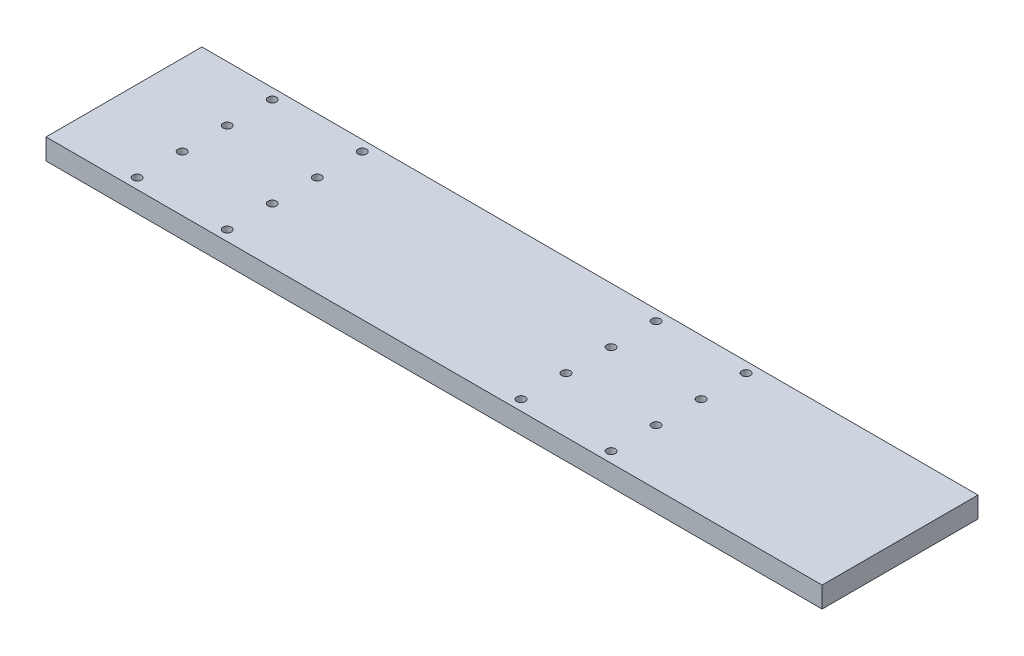
ISO-10303-21;
HEADER;
FILE_DESCRIPTION(('STEP AP214'),'2;1');
FILE_NAME('part.step','',(''),(''),'','','');
FILE_SCHEMA(('AUTOMOTIVE_DESIGN { 1 0 10303 214 1 1 1 1 }'));
ENDSEC;
DATA;
#1=APPLICATION_CONTEXT('core data for automotive mechanical design processes');
#2=APPLICATION_PROTOCOL_DEFINITION('international standard','automotive_design',2000,#1);
#3=PRODUCT_CONTEXT('',#1,'mechanical');
#4=PRODUCT('Part','Part','',(#3));
#5=PRODUCT_RELATED_PRODUCT_CATEGORY('part','',(#4));
#6=PRODUCT_DEFINITION_FORMATION('','',#4);
#7=PRODUCT_DEFINITION_CONTEXT('part definition',#1,'design');
#8=PRODUCT_DEFINITION('design','',#6,#7);
#9=PRODUCT_DEFINITION_SHAPE('','',#8);
#10=(LENGTH_UNIT() NAMED_UNIT(*) SI_UNIT(.MILLI.,.METRE.));
#11=(NAMED_UNIT(*) PLANE_ANGLE_UNIT() SI_UNIT($,.RADIAN.));
#12=(NAMED_UNIT(*) SI_UNIT($,.STERADIAN.) SOLID_ANGLE_UNIT());
#13=UNCERTAINTY_MEASURE_WITH_UNIT(LENGTH_MEASURE(1.E-05),#10,'distance_accuracy_value','');
#14=(GEOMETRIC_REPRESENTATION_CONTEXT(3) GLOBAL_UNCERTAINTY_ASSIGNED_CONTEXT((#13)) GLOBAL_UNIT_ASSIGNED_CONTEXT((#10,
#11,#12)) REPRESENTATION_CONTEXT('',''));
#15=CARTESIAN_POINT('',(0.,0.,0.));
#16=DIRECTION('',(0.,0.,1.));
#17=DIRECTION('',(1.,0.,0.));
#18=AXIS2_PLACEMENT_3D('',#15,#16,#17);
#19=CARTESIAN_POINT('',(0.,7.4,0.));
#20=DIRECTION('',(0.,1.,0.));
#21=DIRECTION('',(0.,0.,1.));
#22=AXIS2_PLACEMENT_3D('',#19,#20,#21);
#23=PLANE('',#22);
#24=CARTESIAN_POINT('',(35.6999998895789,7.4,-16.));
#25=DIRECTION('',(0.,1.,0.));
#26=DIRECTION('',(0.,0.,1.));
#27=AXIS2_PLACEMENT_3D('',#24,#25,#26);
#28=CIRCLE('',#27,1.50000000000003);
#29=CARTESIAN_POINT('',(35.6999998895789,7.4,-14.5));
#30=VERTEX_POINT('',#29);
#31=EDGE_CURVE('E190',#30,#30,#28,.T.);
#32=ORIENTED_EDGE('',*,*,#31,.F.);
#33=EDGE_LOOP('',(#32));
#34=FACE_BOUND('',#33,.T.);
#35=CARTESIAN_POINT('',(3.69999994478943,7.4,-32.));
#36=DIRECTION('',(0.,1.,0.));
#37=DIRECTION('',(0.,0.,1.));
#38=AXIS2_PLACEMENT_3D('',#35,#36,#37);
#39=CIRCLE('',#38,1.50000000000003);
#40=CARTESIAN_POINT('',(3.69999994478943,7.4,-30.5));
#41=VERTEX_POINT('',#40);
#42=EDGE_CURVE('E178',#41,#41,#39,.T.);
#43=ORIENTED_EDGE('',*,*,#42,.F.);
#44=EDGE_LOOP('',(#43));
#45=FACE_BOUND('',#44,.T.);
#46=CARTESIAN_POINT('',(140.1,7.4,0.));
#47=DIRECTION('',(0.,1.,0.));
#48=DIRECTION('',(0.,0.,1.));
#49=AXIS2_PLACEMENT_3D('',#46,#47,#48);
#50=CIRCLE('',#49,1.50000000000003);
#51=CARTESIAN_POINT('',(140.1,7.4,1.50000000000001));
#52=VERTEX_POINT('',#51);
#53=EDGE_CURVE('E166',#52,#52,#50,.T.);
#54=ORIENTED_EDGE('',*,*,#53,.F.);
#55=EDGE_LOOP('',(#54));
#56=FACE_BOUND('',#55,.T.);
#57=CARTESIAN_POINT('',(172.1,7.4,-48.));
#58=DIRECTION('',(0.,1.,0.));
#59=DIRECTION('',(0.,0.,1.));
#60=AXIS2_PLACEMENT_3D('',#57,#58,#59);
#61=CIRCLE('',#60,1.50000000000003);
#62=CARTESIAN_POINT('',(172.1,7.4,-46.5));
#63=VERTEX_POINT('',#62);
#64=EDGE_CURVE('E154',#63,#63,#61,.T.);
#65=ORIENTED_EDGE('',*,*,#64,.F.);
#66=EDGE_LOOP('',(#65));
#67=FACE_BOUND('',#66,.T.);
#68=CARTESIAN_POINT('',(172.1,7.4,-32.));
#69=DIRECTION('',(0.,1.,0.));
#70=DIRECTION('',(0.,0.,1.));
#71=AXIS2_PLACEMENT_3D('',#68,#69,#70);
#72=CIRCLE('',#71,1.50000000000003);
#73=CARTESIAN_POINT('',(172.1,7.4,-30.5));
#74=VERTEX_POINT('',#73);
#75=EDGE_CURVE('E142',#74,#74,#72,.T.);
#76=ORIENTED_EDGE('',*,*,#75,.F.);
#77=EDGE_LOOP('',(#76));
#78=FACE_BOUND('',#77,.T.);
#79=CARTESIAN_POINT('',(140.1,7.4,-48.));
#80=DIRECTION('',(0.,1.,0.));
#81=DIRECTION('',(0.,0.,1.));
#82=AXIS2_PLACEMENT_3D('',#79,#80,#81);
#83=CIRCLE('',#82,1.50000000000003);
#84=CARTESIAN_POINT('',(140.1,7.4,-46.5));
#85=VERTEX_POINT('',#84);
#86=EDGE_CURVE('E130',#85,#85,#83,.T.);
#87=ORIENTED_EDGE('',*,*,#86,.F.);
#88=EDGE_LOOP('',(#87));
#89=FACE_BOUND('',#88,.T.);
#90=CARTESIAN_POINT('',(35.7,7.4,0.));
#91=DIRECTION('',(0.,1.,0.));
#92=DIRECTION('',(0.,0.,1.));
#93=AXIS2_PLACEMENT_3D('',#90,#91,#92);
#94=CIRCLE('',#93,1.50000000000003);
#95=CARTESIAN_POINT('',(35.7,7.4,1.50000000000003));
#96=VERTEX_POINT('',#95);
#97=EDGE_CURVE('E118',#96,#96,#94,.T.);
#98=ORIENTED_EDGE('',*,*,#97,.F.);
#99=EDGE_LOOP('',(#98));
#100=FACE_BOUND('',#99,.T.);
#101=CARTESIAN_POINT('',(3.69999988957886,7.4,-16.));
#102=DIRECTION('',(0.,1.,0.));
#103=DIRECTION('',(0.,0.,1.));
#104=AXIS2_PLACEMENT_3D('',#101,#102,#103);
#105=CIRCLE('',#104,1.50000000000003);
#106=CARTESIAN_POINT('',(3.69999988957886,7.4,-14.5));
#107=VERTEX_POINT('',#106);
#108=EDGE_CURVE('E100',#107,#107,#105,.T.);
#109=ORIENTED_EDGE('',*,*,#108,.F.);
#110=EDGE_LOOP('',(#109));
#111=FACE_BOUND('',#110,.T.);
#112=DIRECTION('',(0.,0.,-1.));
#113=VECTOR('',#112,1.);
#114=CARTESIAN_POINT('',(250.8,7.4,3.69999999999997));
#115=LINE('',#114,#113);
#116=CARTESIAN_POINT('',(250.8,7.4,3.69999999999997));
#117=VERTEX_POINT('',#116);
#118=CARTESIAN_POINT('',(250.8,7.4,-51.7));
#119=VERTEX_POINT('',#118);
#120=EDGE_CURVE('E83',#117,#119,#115,.T.);
#121=ORIENTED_EDGE('',*,*,#120,.T.);
#122=DIRECTION('',(-1.,0.,0.));
#123=VECTOR('',#122,1.);
#124=CARTESIAN_POINT('',(250.8,7.4,-51.7));
#125=LINE('',#124,#123);
#126=CARTESIAN_POINT('',(-25.,7.4,-51.7));
#127=VERTEX_POINT('',#126);
#128=EDGE_CURVE('E77',#119,#127,#125,.T.);
#129=ORIENTED_EDGE('',*,*,#128,.T.);
#130=DIRECTION('',(0.,0.,1.));
#131=VECTOR('',#130,1.);
#132=CARTESIAN_POINT('',(-25.,7.4,-51.7));
#133=LINE('',#132,#131);
#134=CARTESIAN_POINT('',(-25.,7.4,3.7));
#135=VERTEX_POINT('',#134);
#136=EDGE_CURVE('E80',#127,#135,#133,.T.);
#137=ORIENTED_EDGE('',*,*,#136,.T.);
#138=DIRECTION('',(1.,0.,0.));
#139=VECTOR('',#138,1.);
#140=CARTESIAN_POINT('',(-25.,7.4,3.7));
#141=LINE('',#140,#139);
#142=EDGE_CURVE('E49',#135,#117,#141,.T.);
#143=ORIENTED_EDGE('',*,*,#142,.T.);
#144=EDGE_LOOP('',(#121,#129,#137,#143));
#145=FACE_BOUND('',#144,.T.);
#146=CARTESIAN_POINT('',(3.7,7.4,-48.));
#147=DIRECTION('',(0.,1.,0.));
#148=DIRECTION('',(0.,0.,1.));
#149=AXIS2_PLACEMENT_3D('',#146,#147,#148);
#150=CIRCLE('',#149,1.50000000000003);
#151=CARTESIAN_POINT('',(3.7,7.4,-46.5));
#152=VERTEX_POINT('',#151);
#153=EDGE_CURVE('E112',#152,#152,#150,.T.);
#154=ORIENTED_EDGE('',*,*,#153,.F.);
#155=EDGE_LOOP('',(#154));
#156=FACE_BOUND('',#155,.T.);
#157=CARTESIAN_POINT('',(140.1,7.4,-16.));
#158=DIRECTION('',(0.,1.,0.));
#159=DIRECTION('',(0.,0.,1.));
#160=AXIS2_PLACEMENT_3D('',#157,#158,#159);
#161=CIRCLE('',#160,1.50000000000003);
#162=CARTESIAN_POINT('',(140.1,7.4,-14.5));
#163=VERTEX_POINT('',#162);
#164=EDGE_CURVE('E124',#163,#163,#161,.T.);
#165=ORIENTED_EDGE('',*,*,#164,.F.);
#166=EDGE_LOOP('',(#165));
#167=FACE_BOUND('',#166,.T.);
#168=CARTESIAN_POINT('',(172.1,7.4,0.));
#169=DIRECTION('',(0.,1.,0.));
#170=DIRECTION('',(0.,0.,1.));
#171=AXIS2_PLACEMENT_3D('',#168,#169,#170);
#172=CIRCLE('',#171,1.50000000000003);
#173=CARTESIAN_POINT('',(172.1,7.4,1.50000000000001));
#174=VERTEX_POINT('',#173);
#175=EDGE_CURVE('E136',#174,#174,#172,.T.);
#176=ORIENTED_EDGE('',*,*,#175,.F.);
#177=EDGE_LOOP('',(#176));
#178=FACE_BOUND('',#177,.T.);
#179=CARTESIAN_POINT('',(140.1,7.4,-32.));
#180=DIRECTION('',(0.,1.,0.));
#181=DIRECTION('',(0.,0.,1.));
#182=AXIS2_PLACEMENT_3D('',#179,#180,#181);
#183=CIRCLE('',#182,1.50000000000003);
#184=CARTESIAN_POINT('',(140.1,7.4,-30.5));
#185=VERTEX_POINT('',#184);
#186=EDGE_CURVE('E148',#185,#185,#183,.T.);
#187=ORIENTED_EDGE('',*,*,#186,.F.);
#188=EDGE_LOOP('',(#187));
#189=FACE_BOUND('',#188,.T.);
#190=CARTESIAN_POINT('',(172.1,7.4,-16.));
#191=DIRECTION('',(0.,1.,0.));
#192=DIRECTION('',(0.,0.,1.));
#193=AXIS2_PLACEMENT_3D('',#190,#191,#192);
#194=CIRCLE('',#193,1.50000000000003);
#195=CARTESIAN_POINT('',(172.1,7.4,-14.5));
#196=VERTEX_POINT('',#195);
#197=EDGE_CURVE('E160',#196,#196,#194,.T.);
#198=ORIENTED_EDGE('',*,*,#197,.F.);
#199=EDGE_LOOP('',(#198));
#200=FACE_BOUND('',#199,.T.);
#201=CARTESIAN_POINT('',(35.6999998895789,7.4,-32.));
#202=DIRECTION('',(0.,1.,0.));
#203=DIRECTION('',(0.,0.,1.));
#204=AXIS2_PLACEMENT_3D('',#201,#202,#203);
#205=CIRCLE('',#204,1.50000000000003);
#206=CARTESIAN_POINT('',(35.6999998895789,7.4,-30.5));
#207=VERTEX_POINT('',#206);
#208=EDGE_CURVE('E172',#207,#207,#205,.T.);
#209=ORIENTED_EDGE('',*,*,#208,.F.);
#210=EDGE_LOOP('',(#209));
#211=FACE_BOUND('',#210,.T.);
#212=CARTESIAN_POINT('',(35.7,7.4,-48.));
#213=DIRECTION('',(0.,1.,0.));
#214=DIRECTION('',(0.,0.,1.));
#215=AXIS2_PLACEMENT_3D('',#212,#213,#214);
#216=CIRCLE('',#215,1.50000000000003);
#217=CARTESIAN_POINT('',(35.7,7.4,-46.5));
#218=VERTEX_POINT('',#217);
#219=EDGE_CURVE('E184',#218,#218,#216,.T.);
#220=ORIENTED_EDGE('',*,*,#219,.F.);
#221=EDGE_LOOP('',(#220));
#222=FACE_BOUND('',#221,.T.);
#223=CARTESIAN_POINT('',(3.7,7.4,0.));
#224=DIRECTION('',(0.,1.,0.));
#225=DIRECTION('',(0.,0.,1.));
#226=AXIS2_PLACEMENT_3D('',#223,#224,#225);
#227=CIRCLE('',#226,1.50000000000003);
#228=CARTESIAN_POINT('',(3.7,7.4,1.50000000000003));
#229=VERTEX_POINT('',#228);
#230=EDGE_CURVE('E196',#229,#229,#227,.T.);
#231=ORIENTED_EDGE('',*,*,#230,.F.);
#232=EDGE_LOOP('',(#231));
#233=FACE_BOUND('',#232,.T.);
#234=ADVANCED_FACE('F32',(#34,#45,#56,#67,#78,#89,#100,#111,#145,#156,#167,#178,#189,#200,#211,
#222,#233),#23,.T.);
#235=CARTESIAN_POINT('',(0.,0.,0.));
#236=DIRECTION('',(0.,1.,0.));
#237=DIRECTION('',(0.,0.,1.));
#238=AXIS2_PLACEMENT_3D('',#235,#236,#237);
#239=PLANE('',#238);
#240=DIRECTION('',(0.,0.,-1.));
#241=VECTOR('',#240,1.);
#242=CARTESIAN_POINT('',(250.8,0.,3.69999999999997));
#243=LINE('',#242,#241);
#244=CARTESIAN_POINT('',(250.8,0.,3.69999999999997));
#245=VERTEX_POINT('',#244);
#246=CARTESIAN_POINT('',(250.8,0.,-51.7));
#247=VERTEX_POINT('',#246);
#248=EDGE_CURVE('E97',#245,#247,#243,.T.);
#249=ORIENTED_EDGE('',*,*,#248,.F.);
#250=DIRECTION('',(1.,0.,0.));
#251=VECTOR('',#250,1.);
#252=CARTESIAN_POINT('',(250.8,0.,3.69999999999997));
#253=LINE('',#252,#251);
#254=CARTESIAN_POINT('',(-25.,0.,3.7));
#255=VERTEX_POINT('',#254);
#256=EDGE_CURVE('E66',#255,#245,#253,.T.);
#257=ORIENTED_EDGE('',*,*,#256,.F.);
#258=DIRECTION('',(0.,0.,1.));
#259=VECTOR('',#258,1.);
#260=CARTESIAN_POINT('',(-25.,0.,-51.7));
#261=LINE('',#260,#259);
#262=CARTESIAN_POINT('',(-25.,0.,-51.7));
#263=VERTEX_POINT('',#262);
#264=EDGE_CURVE('E102',#263,#255,#261,.T.);
#265=ORIENTED_EDGE('',*,*,#264,.F.);
#266=DIRECTION('',(-1.,0.,0.));
#267=VECTOR('',#266,1.);
#268=CARTESIAN_POINT('',(0.,0.,-51.7));
#269=LINE('',#268,#267);
#270=EDGE_CURVE('E88',#247,#263,#269,.T.);
#271=ORIENTED_EDGE('',*,*,#270,.F.);
#272=EDGE_LOOP('',(#249,#257,#265,#271));
#273=FACE_BOUND('',#272,.T.);
#274=CARTESIAN_POINT('',(3.69999988957886,0.,-16.));
#275=DIRECTION('',(0.,1.,0.));
#276=DIRECTION('',(0.,0.,1.));
#277=AXIS2_PLACEMENT_3D('',#274,#275,#276);
#278=CIRCLE('',#277,1.50000000000003);
#279=CARTESIAN_POINT('',(3.69999988957886,0.,-14.5));
#280=VERTEX_POINT('',#279);
#281=EDGE_CURVE('E109',#280,#280,#278,.T.);
#282=ORIENTED_EDGE('',*,*,#281,.T.);
#283=EDGE_LOOP('',(#282));
#284=FACE_BOUND('',#283,.T.);
#285=CARTESIAN_POINT('',(3.7,0.,-48.));
#286=DIRECTION('',(0.,1.,0.));
#287=DIRECTION('',(0.,0.,1.));
#288=AXIS2_PLACEMENT_3D('',#285,#286,#287);
#289=CIRCLE('',#288,1.50000000000003);
#290=CARTESIAN_POINT('',(3.7,0.,-46.5));
#291=VERTEX_POINT('',#290);
#292=EDGE_CURVE('E115',#291,#291,#289,.T.);
#293=ORIENTED_EDGE('',*,*,#292,.T.);
#294=EDGE_LOOP('',(#293));
#295=FACE_BOUND('',#294,.T.);
#296=CARTESIAN_POINT('',(35.7,0.,0.));
#297=DIRECTION('',(0.,1.,0.));
#298=DIRECTION('',(0.,0.,1.));
#299=AXIS2_PLACEMENT_3D('',#296,#297,#298);
#300=CIRCLE('',#299,1.50000000000003);
#301=CARTESIAN_POINT('',(35.7,0.,1.50000000000003));
#302=VERTEX_POINT('',#301);
#303=EDGE_CURVE('E121',#302,#302,#300,.T.);
#304=ORIENTED_EDGE('',*,*,#303,.T.);
#305=EDGE_LOOP('',(#304));
#306=FACE_BOUND('',#305,.T.);
#307=CARTESIAN_POINT('',(140.1,0.,-16.));
#308=DIRECTION('',(0.,1.,0.));
#309=DIRECTION('',(0.,0.,1.));
#310=AXIS2_PLACEMENT_3D('',#307,#308,#309);
#311=CIRCLE('',#310,1.50000000000003);
#312=CARTESIAN_POINT('',(140.1,0.,-14.5));
#313=VERTEX_POINT('',#312);
#314=EDGE_CURVE('E127',#313,#313,#311,.T.);
#315=ORIENTED_EDGE('',*,*,#314,.T.);
#316=EDGE_LOOP('',(#315));
#317=FACE_BOUND('',#316,.T.);
#318=CARTESIAN_POINT('',(140.1,0.,-48.));
#319=DIRECTION('',(0.,1.,0.));
#320=DIRECTION('',(0.,0.,1.));
#321=AXIS2_PLACEMENT_3D('',#318,#319,#320);
#322=CIRCLE('',#321,1.50000000000003);
#323=CARTESIAN_POINT('',(140.1,0.,-46.5));
#324=VERTEX_POINT('',#323);
#325=EDGE_CURVE('E133',#324,#324,#322,.T.);
#326=ORIENTED_EDGE('',*,*,#325,.T.);
#327=EDGE_LOOP('',(#326));
#328=FACE_BOUND('',#327,.T.);
#329=CARTESIAN_POINT('',(172.1,0.,0.));
#330=DIRECTION('',(0.,1.,0.));
#331=DIRECTION('',(0.,0.,1.));
#332=AXIS2_PLACEMENT_3D('',#329,#330,#331);
#333=CIRCLE('',#332,1.50000000000003);
#334=CARTESIAN_POINT('',(172.1,0.,1.50000000000001));
#335=VERTEX_POINT('',#334);
#336=EDGE_CURVE('E139',#335,#335,#333,.T.);
#337=ORIENTED_EDGE('',*,*,#336,.T.);
#338=EDGE_LOOP('',(#337));
#339=FACE_BOUND('',#338,.T.);
#340=CARTESIAN_POINT('',(172.1,0.,-32.));
#341=DIRECTION('',(0.,1.,0.));
#342=DIRECTION('',(0.,0.,1.));
#343=AXIS2_PLACEMENT_3D('',#340,#341,#342);
#344=CIRCLE('',#343,1.50000000000003);
#345=CARTESIAN_POINT('',(172.1,0.,-30.5));
#346=VERTEX_POINT('',#345);
#347=EDGE_CURVE('E145',#346,#346,#344,.T.);
#348=ORIENTED_EDGE('',*,*,#347,.T.);
#349=EDGE_LOOP('',(#348));
#350=FACE_BOUND('',#349,.T.);
#351=CARTESIAN_POINT('',(140.1,0.,-32.));
#352=DIRECTION('',(0.,1.,0.));
#353=DIRECTION('',(0.,0.,1.));
#354=AXIS2_PLACEMENT_3D('',#351,#352,#353);
#355=CIRCLE('',#354,1.50000000000003);
#356=CARTESIAN_POINT('',(140.1,0.,-30.5));
#357=VERTEX_POINT('',#356);
#358=EDGE_CURVE('E151',#357,#357,#355,.T.);
#359=ORIENTED_EDGE('',*,*,#358,.T.);
#360=EDGE_LOOP('',(#359));
#361=FACE_BOUND('',#360,.T.);
#362=CARTESIAN_POINT('',(172.1,0.,-48.));
#363=DIRECTION('',(0.,1.,0.));
#364=DIRECTION('',(0.,0.,1.));
#365=AXIS2_PLACEMENT_3D('',#362,#363,#364);
#366=CIRCLE('',#365,1.50000000000003);
#367=CARTESIAN_POINT('',(172.1,0.,-46.5));
#368=VERTEX_POINT('',#367);
#369=EDGE_CURVE('E157',#368,#368,#366,.T.);
#370=ORIENTED_EDGE('',*,*,#369,.T.);
#371=EDGE_LOOP('',(#370));
#372=FACE_BOUND('',#371,.T.);
#373=CARTESIAN_POINT('',(172.1,0.,-16.));
#374=DIRECTION('',(0.,1.,0.));
#375=DIRECTION('',(0.,0.,1.));
#376=AXIS2_PLACEMENT_3D('',#373,#374,#375);
#377=CIRCLE('',#376,1.50000000000003);
#378=CARTESIAN_POINT('',(172.1,0.,-14.5));
#379=VERTEX_POINT('',#378);
#380=EDGE_CURVE('E163',#379,#379,#377,.T.);
#381=ORIENTED_EDGE('',*,*,#380,.T.);
#382=EDGE_LOOP('',(#381));
#383=FACE_BOUND('',#382,.T.);
#384=CARTESIAN_POINT('',(140.1,0.,0.));
#385=DIRECTION('',(0.,1.,0.));
#386=DIRECTION('',(0.,0.,1.));
#387=AXIS2_PLACEMENT_3D('',#384,#385,#386);
#388=CIRCLE('',#387,1.50000000000003);
#389=CARTESIAN_POINT('',(140.1,0.,1.50000000000001));
#390=VERTEX_POINT('',#389);
#391=EDGE_CURVE('E169',#390,#390,#388,.T.);
#392=ORIENTED_EDGE('',*,*,#391,.T.);
#393=EDGE_LOOP('',(#392));
#394=FACE_BOUND('',#393,.T.);
#395=CARTESIAN_POINT('',(35.6999998895789,0.,-32.));
#396=DIRECTION('',(0.,1.,0.));
#397=DIRECTION('',(0.,0.,1.));
#398=AXIS2_PLACEMENT_3D('',#395,#396,#397);
#399=CIRCLE('',#398,1.50000000000003);
#400=CARTESIAN_POINT('',(35.6999998895789,0.,-30.5));
#401=VERTEX_POINT('',#400);
#402=EDGE_CURVE('E175',#401,#401,#399,.T.);
#403=ORIENTED_EDGE('',*,*,#402,.T.);
#404=EDGE_LOOP('',(#403));
#405=FACE_BOUND('',#404,.T.);
#406=CARTESIAN_POINT('',(3.69999994478943,0.,-32.));
#407=DIRECTION('',(0.,1.,0.));
#408=DIRECTION('',(0.,0.,1.));
#409=AXIS2_PLACEMENT_3D('',#406,#407,#408);
#410=CIRCLE('',#409,1.50000000000003);
#411=CARTESIAN_POINT('',(3.69999994478943,0.,-30.5));
#412=VERTEX_POINT('',#411);
#413=EDGE_CURVE('E181',#412,#412,#410,.T.);
#414=ORIENTED_EDGE('',*,*,#413,.T.);
#415=EDGE_LOOP('',(#414));
#416=FACE_BOUND('',#415,.T.);
#417=CARTESIAN_POINT('',(35.7,0.,-48.));
#418=DIRECTION('',(0.,1.,0.));
#419=DIRECTION('',(0.,0.,1.));
#420=AXIS2_PLACEMENT_3D('',#417,#418,#419);
#421=CIRCLE('',#420,1.50000000000003);
#422=CARTESIAN_POINT('',(35.7,0.,-46.5));
#423=VERTEX_POINT('',#422);
#424=EDGE_CURVE('E187',#423,#423,#421,.T.);
#425=ORIENTED_EDGE('',*,*,#424,.T.);
#426=EDGE_LOOP('',(#425));
#427=FACE_BOUND('',#426,.T.);
#428=CARTESIAN_POINT('',(35.6999998895789,0.,-16.));
#429=DIRECTION('',(0.,1.,0.));
#430=DIRECTION('',(0.,0.,1.));
#431=AXIS2_PLACEMENT_3D('',#428,#429,#430);
#432=CIRCLE('',#431,1.50000000000003);
#433=CARTESIAN_POINT('',(35.6999998895789,0.,-14.5));
#434=VERTEX_POINT('',#433);
#435=EDGE_CURVE('E193',#434,#434,#432,.T.);
#436=ORIENTED_EDGE('',*,*,#435,.T.);
#437=EDGE_LOOP('',(#436));
#438=FACE_BOUND('',#437,.T.);
#439=CARTESIAN_POINT('',(3.7,0.,0.));
#440=DIRECTION('',(0.,1.,0.));
#441=DIRECTION('',(0.,0.,1.));
#442=AXIS2_PLACEMENT_3D('',#439,#440,#441);
#443=CIRCLE('',#442,1.50000000000003);
#444=CARTESIAN_POINT('',(3.7,0.,1.50000000000003));
#445=VERTEX_POINT('',#444);
#446=EDGE_CURVE('E199',#445,#445,#443,.T.);
#447=ORIENTED_EDGE('',*,*,#446,.T.);
#448=EDGE_LOOP('',(#447));
#449=FACE_BOUND('',#448,.T.);
#450=ADVANCED_FACE('F209',(#273,#284,#295,#306,#317,#328,#339,#350,#361,#372,#383,#394,#405,
#416,#427,#438,#449),#239,.F.);
#451=CARTESIAN_POINT('',(250.8,7.4,3.69999999999997));
#452=DIRECTION('',(-1.,0.,0.));
#453=DIRECTION('',(0.,0.,1.));
#454=AXIS2_PLACEMENT_3D('',#451,#452,#453);
#455=PLANE('',#454);
#456=ORIENTED_EDGE('',*,*,#248,.T.);
#457=DIRECTION('',(0.,-1.,0.));
#458=VECTOR('',#457,1.);
#459=CARTESIAN_POINT('',(250.8,7.4,-51.7));
#460=LINE('',#459,#458);
#461=EDGE_CURVE('E11',#119,#247,#460,.T.);
#462=ORIENTED_EDGE('',*,*,#461,.F.);
#463=ORIENTED_EDGE('',*,*,#120,.F.);
#464=DIRECTION('',(0.,-1.,0.));
#465=VECTOR('',#464,1.);
#466=CARTESIAN_POINT('',(250.8,7.4,3.69999999999997));
#467=LINE('',#466,#465);
#468=EDGE_CURVE('E93',#117,#245,#467,.T.);
#469=ORIENTED_EDGE('',*,*,#468,.T.);
#470=EDGE_LOOP('',(#456,#462,#463,#469));
#471=FACE_BOUND('',#470,.T.);
#472=ADVANCED_FACE('F34',(#471),#455,.F.);
#473=CARTESIAN_POINT('',(0.,7.4,-51.7));
#474=DIRECTION('',(0.,0.,1.));
#475=DIRECTION('',(1.,0.,0.));
#476=AXIS2_PLACEMENT_3D('',#473,#474,#475);
#477=PLANE('',#476);
#478=ORIENTED_EDGE('',*,*,#270,.T.);
#479=DIRECTION('',(0.,-1.,0.));
#480=VECTOR('',#479,1.);
#481=CARTESIAN_POINT('',(-25.,7.4,-51.7));
#482=LINE('',#481,#480);
#483=EDGE_CURVE('E41',#127,#263,#482,.T.);
#484=ORIENTED_EDGE('',*,*,#483,.F.);
#485=ORIENTED_EDGE('',*,*,#128,.F.);
#486=ORIENTED_EDGE('',*,*,#461,.T.);
#487=EDGE_LOOP('',(#478,#484,#485,#486));
#488=FACE_BOUND('',#487,.T.);
#489=ADVANCED_FACE('F87',(#488),#477,.F.);
#490=CARTESIAN_POINT('',(-25.,7.4,-51.7));
#491=DIRECTION('',(1.,0.,0.));
#492=DIRECTION('',(0.,0.,-1.));
#493=AXIS2_PLACEMENT_3D('',#490,#491,#492);
#494=PLANE('',#493);
#495=ORIENTED_EDGE('',*,*,#264,.T.);
#496=DIRECTION('',(0.,-1.,0.));
#497=VECTOR('',#496,1.);
#498=CARTESIAN_POINT('',(-25.,7.4,3.7));
#499=LINE('',#498,#497);
#500=EDGE_CURVE('E90',#135,#255,#499,.T.);
#501=ORIENTED_EDGE('',*,*,#500,.F.);
#502=ORIENTED_EDGE('',*,*,#136,.F.);
#503=ORIENTED_EDGE('',*,*,#483,.T.);
#504=EDGE_LOOP('',(#495,#501,#502,#503));
#505=FACE_BOUND('',#504,.T.);
#506=ADVANCED_FACE('F91',(#505),#494,.F.);
#507=CARTESIAN_POINT('',(250.8,7.4,3.69999999999997));
#508=DIRECTION('',(0.,0.,-1.));
#509=DIRECTION('',(-1.,0.,0.));
#510=AXIS2_PLACEMENT_3D('',#507,#508,#509);
#511=PLANE('',#510);
#512=ORIENTED_EDGE('',*,*,#256,.T.);
#513=ORIENTED_EDGE('',*,*,#468,.F.);
#514=ORIENTED_EDGE('',*,*,#142,.F.);
#515=ORIENTED_EDGE('',*,*,#500,.T.);
#516=EDGE_LOOP('',(#512,#513,#514,#515));
#517=FACE_BOUND('',#516,.T.);
#518=ADVANCED_FACE('F106',(#517),#511,.F.);
#519=CARTESIAN_POINT('',(3.69999988957886,7.4,-16.));
#520=DIRECTION('',(0.,-1.,0.));
#521=DIRECTION('',(0.,0.,-1.));
#522=AXIS2_PLACEMENT_3D('',#519,#520,#521);
#523=CYLINDRICAL_SURFACE('',#522,1.50000000000003);
#524=ORIENTED_EDGE('',*,*,#108,.T.);
#525=EDGE_LOOP('',(#524));
#526=FACE_BOUND('',#525,.T.);
#527=ORIENTED_EDGE('',*,*,#281,.F.);
#528=EDGE_LOOP('',(#527));
#529=FACE_BOUND('',#528,.T.);
#530=ADVANCED_FACE('F219',(#526,#529),#523,.F.);
#531=CARTESIAN_POINT('',(3.7,7.4,-48.));
#532=DIRECTION('',(0.,-1.,0.));
#533=DIRECTION('',(0.,0.,-1.));
#534=AXIS2_PLACEMENT_3D('',#531,#532,#533);
#535=CYLINDRICAL_SURFACE('',#534,1.50000000000003);
#536=ORIENTED_EDGE('',*,*,#153,.T.);
#537=EDGE_LOOP('',(#536));
#538=FACE_BOUND('',#537,.T.);
#539=ORIENTED_EDGE('',*,*,#292,.F.);
#540=EDGE_LOOP('',(#539));
#541=FACE_BOUND('',#540,.T.);
#542=ADVANCED_FACE('F271',(#538,#541),#535,.F.);
#543=CARTESIAN_POINT('',(35.7,7.4,0.));
#544=DIRECTION('',(0.,-1.,0.));
#545=DIRECTION('',(0.,0.,-1.));
#546=AXIS2_PLACEMENT_3D('',#543,#544,#545);
#547=CYLINDRICAL_SURFACE('',#546,1.50000000000003);
#548=ORIENTED_EDGE('',*,*,#97,.T.);
#549=EDGE_LOOP('',(#548));
#550=FACE_BOUND('',#549,.T.);
#551=ORIENTED_EDGE('',*,*,#303,.F.);
#552=EDGE_LOOP('',(#551));
#553=FACE_BOUND('',#552,.T.);
#554=ADVANCED_FACE('F279',(#550,#553),#547,.F.);
#555=CARTESIAN_POINT('',(140.1,7.4,-16.));
#556=DIRECTION('',(0.,-1.,0.));
#557=DIRECTION('',(0.,0.,-1.));
#558=AXIS2_PLACEMENT_3D('',#555,#556,#557);
#559=CYLINDRICAL_SURFACE('',#558,1.50000000000003);
#560=ORIENTED_EDGE('',*,*,#164,.T.);
#561=EDGE_LOOP('',(#560));
#562=FACE_BOUND('',#561,.T.);
#563=ORIENTED_EDGE('',*,*,#314,.F.);
#564=EDGE_LOOP('',(#563));
#565=FACE_BOUND('',#564,.T.);
#566=ADVANCED_FACE('F287',(#562,#565),#559,.F.);
#567=CARTESIAN_POINT('',(140.1,7.4,-48.));
#568=DIRECTION('',(0.,-1.,0.));
#569=DIRECTION('',(0.,0.,-1.));
#570=AXIS2_PLACEMENT_3D('',#567,#568,#569);
#571=CYLINDRICAL_SURFACE('',#570,1.50000000000003);
#572=ORIENTED_EDGE('',*,*,#86,.T.);
#573=EDGE_LOOP('',(#572));
#574=FACE_BOUND('',#573,.T.);
#575=ORIENTED_EDGE('',*,*,#325,.F.);
#576=EDGE_LOOP('',(#575));
#577=FACE_BOUND('',#576,.T.);
#578=ADVANCED_FACE('F296',(#574,#577),#571,.F.);
#579=CARTESIAN_POINT('',(172.1,7.4,0.));
#580=DIRECTION('',(0.,-1.,0.));
#581=DIRECTION('',(0.,0.,-1.));
#582=AXIS2_PLACEMENT_3D('',#579,#580,#581);
#583=CYLINDRICAL_SURFACE('',#582,1.50000000000003);
#584=ORIENTED_EDGE('',*,*,#175,.T.);
#585=EDGE_LOOP('',(#584));
#586=FACE_BOUND('',#585,.T.);
#587=ORIENTED_EDGE('',*,*,#336,.F.);
#588=EDGE_LOOP('',(#587));
#589=FACE_BOUND('',#588,.T.);
#590=ADVANCED_FACE('F305',(#586,#589),#583,.F.);
#591=CARTESIAN_POINT('',(172.1,7.4,-32.));
#592=DIRECTION('',(0.,-1.,0.));
#593=DIRECTION('',(0.,0.,-1.));
#594=AXIS2_PLACEMENT_3D('',#591,#592,#593);
#595=CYLINDRICAL_SURFACE('',#594,1.50000000000003);
#596=ORIENTED_EDGE('',*,*,#75,.T.);
#597=EDGE_LOOP('',(#596));
#598=FACE_BOUND('',#597,.T.);
#599=ORIENTED_EDGE('',*,*,#347,.F.);
#600=EDGE_LOOP('',(#599));
#601=FACE_BOUND('',#600,.T.);
#602=ADVANCED_FACE('F314',(#598,#601),#595,.F.);
#603=CARTESIAN_POINT('',(140.1,7.4,-32.));
#604=DIRECTION('',(0.,-1.,0.));
#605=DIRECTION('',(0.,0.,-1.));
#606=AXIS2_PLACEMENT_3D('',#603,#604,#605);
#607=CYLINDRICAL_SURFACE('',#606,1.50000000000003);
#608=ORIENTED_EDGE('',*,*,#186,.T.);
#609=EDGE_LOOP('',(#608));
#610=FACE_BOUND('',#609,.T.);
#611=ORIENTED_EDGE('',*,*,#358,.F.);
#612=EDGE_LOOP('',(#611));
#613=FACE_BOUND('',#612,.T.);
#614=ADVANCED_FACE('F323',(#610,#613),#607,.F.);
#615=CARTESIAN_POINT('',(172.1,7.4,-48.));
#616=DIRECTION('',(0.,-1.,0.));
#617=DIRECTION('',(0.,0.,-1.));
#618=AXIS2_PLACEMENT_3D('',#615,#616,#617);
#619=CYLINDRICAL_SURFACE('',#618,1.50000000000003);
#620=ORIENTED_EDGE('',*,*,#64,.T.);
#621=EDGE_LOOP('',(#620));
#622=FACE_BOUND('',#621,.T.);
#623=ORIENTED_EDGE('',*,*,#369,.F.);
#624=EDGE_LOOP('',(#623));
#625=FACE_BOUND('',#624,.T.);
#626=ADVANCED_FACE('F332',(#622,#625),#619,.F.);
#627=CARTESIAN_POINT('',(172.1,7.4,-16.));
#628=DIRECTION('',(0.,-1.,0.));
#629=DIRECTION('',(0.,0.,-1.));
#630=AXIS2_PLACEMENT_3D('',#627,#628,#629);
#631=CYLINDRICAL_SURFACE('',#630,1.50000000000003);
#632=ORIENTED_EDGE('',*,*,#197,.T.);
#633=EDGE_LOOP('',(#632));
#634=FACE_BOUND('',#633,.T.);
#635=ORIENTED_EDGE('',*,*,#380,.F.);
#636=EDGE_LOOP('',(#635));
#637=FACE_BOUND('',#636,.T.);
#638=ADVANCED_FACE('F341',(#634,#637),#631,.F.);
#639=CARTESIAN_POINT('',(140.1,7.4,0.));
#640=DIRECTION('',(0.,-1.,0.));
#641=DIRECTION('',(0.,0.,-1.));
#642=AXIS2_PLACEMENT_3D('',#639,#640,#641);
#643=CYLINDRICAL_SURFACE('',#642,1.50000000000003);
#644=ORIENTED_EDGE('',*,*,#53,.T.);
#645=EDGE_LOOP('',(#644));
#646=FACE_BOUND('',#645,.T.);
#647=ORIENTED_EDGE('',*,*,#391,.F.);
#648=EDGE_LOOP('',(#647));
#649=FACE_BOUND('',#648,.T.);
#650=ADVANCED_FACE('F350',(#646,#649),#643,.F.);
#651=CARTESIAN_POINT('',(35.6999998895789,7.4,-32.));
#652=DIRECTION('',(0.,-1.,0.));
#653=DIRECTION('',(0.,0.,-1.));
#654=AXIS2_PLACEMENT_3D('',#651,#652,#653);
#655=CYLINDRICAL_SURFACE('',#654,1.50000000000003);
#656=ORIENTED_EDGE('',*,*,#208,.T.);
#657=EDGE_LOOP('',(#656));
#658=FACE_BOUND('',#657,.T.);
#659=ORIENTED_EDGE('',*,*,#402,.F.);
#660=EDGE_LOOP('',(#659));
#661=FACE_BOUND('',#660,.T.);
#662=ADVANCED_FACE('F359',(#658,#661),#655,.F.);
#663=CARTESIAN_POINT('',(3.69999994478943,7.4,-32.));
#664=DIRECTION('',(0.,-1.,0.));
#665=DIRECTION('',(0.,0.,-1.));
#666=AXIS2_PLACEMENT_3D('',#663,#664,#665);
#667=CYLINDRICAL_SURFACE('',#666,1.50000000000003);
#668=ORIENTED_EDGE('',*,*,#42,.T.);
#669=EDGE_LOOP('',(#668));
#670=FACE_BOUND('',#669,.T.);
#671=ORIENTED_EDGE('',*,*,#413,.F.);
#672=EDGE_LOOP('',(#671));
#673=FACE_BOUND('',#672,.T.);
#674=ADVANCED_FACE('F368',(#670,#673),#667,.F.);
#675=CARTESIAN_POINT('',(35.7,7.4,-48.));
#676=DIRECTION('',(0.,-1.,0.));
#677=DIRECTION('',(0.,0.,-1.));
#678=AXIS2_PLACEMENT_3D('',#675,#676,#677);
#679=CYLINDRICAL_SURFACE('',#678,1.50000000000003);
#680=ORIENTED_EDGE('',*,*,#219,.T.);
#681=EDGE_LOOP('',(#680));
#682=FACE_BOUND('',#681,.T.);
#683=ORIENTED_EDGE('',*,*,#424,.F.);
#684=EDGE_LOOP('',(#683));
#685=FACE_BOUND('',#684,.T.);
#686=ADVANCED_FACE('F377',(#682,#685),#679,.F.);
#687=CARTESIAN_POINT('',(35.6999998895789,7.4,-16.));
#688=DIRECTION('',(0.,-1.,0.));
#689=DIRECTION('',(0.,0.,-1.));
#690=AXIS2_PLACEMENT_3D('',#687,#688,#689);
#691=CYLINDRICAL_SURFACE('',#690,1.50000000000003);
#692=ORIENTED_EDGE('',*,*,#31,.T.);
#693=EDGE_LOOP('',(#692));
#694=FACE_BOUND('',#693,.T.);
#695=ORIENTED_EDGE('',*,*,#435,.F.);
#696=EDGE_LOOP('',(#695));
#697=FACE_BOUND('',#696,.T.);
#698=ADVANCED_FACE('F386',(#694,#697),#691,.F.);
#699=CARTESIAN_POINT('',(3.7,7.4,0.));
#700=DIRECTION('',(0.,-1.,0.));
#701=DIRECTION('',(0.,0.,-1.));
#702=AXIS2_PLACEMENT_3D('',#699,#700,#701);
#703=CYLINDRICAL_SURFACE('',#702,1.50000000000003);
#704=ORIENTED_EDGE('',*,*,#230,.T.);
#705=EDGE_LOOP('',(#704));
#706=FACE_BOUND('',#705,.T.);
#707=ORIENTED_EDGE('',*,*,#446,.F.);
#708=EDGE_LOOP('',(#707));
#709=FACE_BOUND('',#708,.T.);
#710=ADVANCED_FACE('F205',(#706,#709),#703,.F.);
#711=CLOSED_SHELL('',(#234,#450,#472,#489,#506,#518,#530,#542,#554,#566,#578,#590,#602,#614,
#626,#638,#650,#662,#674,#686,#698,#710));
#712=MANIFOLD_SOLID_BREP('B2',#711);
#713=ADVANCED_BREP_SHAPE_REPRESENTATION('',(#18,#712),#14);
#714=SHAPE_DEFINITION_REPRESENTATION(#9,#713);
ENDSEC;
END-ISO-10303-21;
